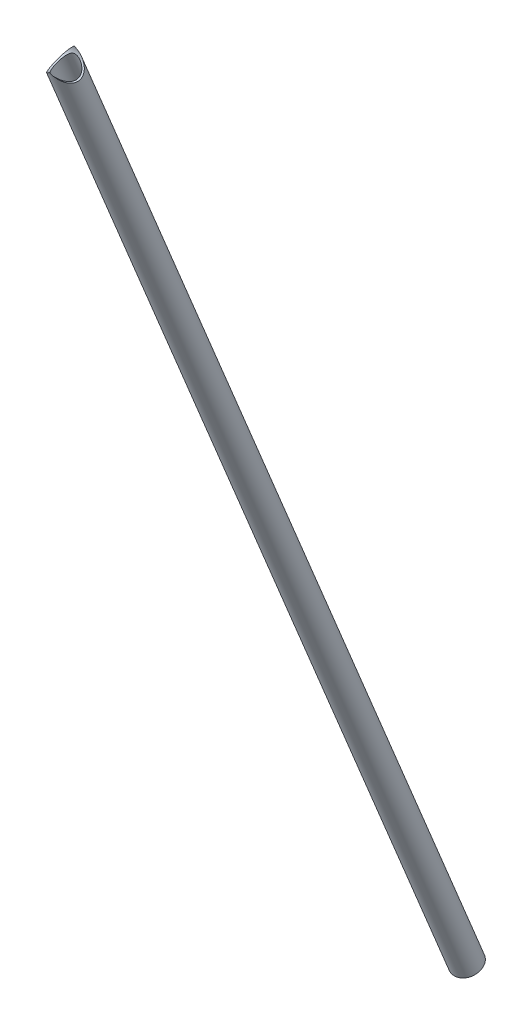
ISO-10303-21;
HEADER;
FILE_DESCRIPTION(('STEP AP214'),'2;1');
FILE_NAME('part.step','',(''),(''),'','','');
FILE_SCHEMA(('AUTOMOTIVE_DESIGN { 1 0 10303 214 1 1 1 1 }'));
ENDSEC;
DATA;
#1=APPLICATION_CONTEXT('core data for automotive mechanical design processes');
#2=APPLICATION_PROTOCOL_DEFINITION('international standard','automotive_design',2000,#1);
#3=PRODUCT_CONTEXT('',#1,'mechanical');
#4=PRODUCT('Part','Part','',(#3));
#5=PRODUCT_RELATED_PRODUCT_CATEGORY('part','',(#4));
#6=PRODUCT_DEFINITION_FORMATION('','',#4);
#7=PRODUCT_DEFINITION_CONTEXT('part definition',#1,'design');
#8=PRODUCT_DEFINITION('design','',#6,#7);
#9=PRODUCT_DEFINITION_SHAPE('','',#8);
#10=(LENGTH_UNIT() NAMED_UNIT(*) SI_UNIT(.MILLI.,.METRE.));
#11=(NAMED_UNIT(*) PLANE_ANGLE_UNIT() SI_UNIT($,.RADIAN.));
#12=(NAMED_UNIT(*) SI_UNIT($,.STERADIAN.) SOLID_ANGLE_UNIT());
#13=UNCERTAINTY_MEASURE_WITH_UNIT(LENGTH_MEASURE(1.E-05),#10,'distance_accuracy_value','');
#14=(GEOMETRIC_REPRESENTATION_CONTEXT(3) GLOBAL_UNCERTAINTY_ASSIGNED_CONTEXT((#13)) GLOBAL_UNIT_ASSIGNED_CONTEXT((#10,
#11,#12)) REPRESENTATION_CONTEXT('',''));
#15=CARTESIAN_POINT('',(0.,0.,0.));
#16=DIRECTION('',(0.,0.,1.));
#17=DIRECTION('',(1.,0.,0.));
#18=AXIS2_PLACEMENT_3D('',#15,#16,#17);
#19=CARTESIAN_POINT('',(-1.11022302462516E-13,220.,-2300.));
#20=DIRECTION('',(0.,0.924802742541058,0.380446957391614));
#21=DIRECTION('',(0.,-0.380446957391614,0.924802742541059));
#22=AXIS2_PLACEMENT_3D('',#19,#20,#21);
#23=CYLINDRICAL_SURFACE('',#22,9.39999999999998);
#24=CARTESIAN_POINT('',(-1.11022302462516E-13,220.,-2300.));
#25=DIRECTION('',(0.,-0.924802742541059,-0.380446957391614));
#26=DIRECTION('',(-0.14944830444176,0.376174363259909,-0.914416782832361));
#27=AXIS2_PLACEMENT_3D('',#24,#25,#26);
#28=CIRCLE('',#27,9.39999999999998);
#29=CARTESIAN_POINT('',(-1.40481406175265,223.536039014643,-2308.59551775862));
#30=VERTEX_POINT('',#29);
#31=EDGE_CURVE('E91',#30,#30,#28,.T.);
#32=ORIENTED_EDGE('',*,*,#31,.T.);
#33=EDGE_LOOP('',(#32));
#34=FACE_BOUND('',#33,.T.);
#35=CARTESIAN_POINT('',(-9.19613038601903,1006.93153407013,-1978.37615864122));
#36=CARTESIAN_POINT('',(-9.2368195698333,1006.8199690487,-1978.21426136457));
#37=CARTESIAN_POINT('',(-9.2716963255508,1006.71220936782,-1978.04829963062));
#38=CARTESIAN_POINT('',(-9.32925982289266,1006.50540981531,-1977.70900862443));
#39=CARTESIAN_POINT('',(-9.35194904871124,1006.4063681701,-1977.53568086138));
#40=CARTESIAN_POINT('',(-9.38470663027585,1006.21807700779,-1977.18271737702));
#41=CARTESIAN_POINT('',(-9.39478028474781,1006.12882339394,-1977.00308433665));
#42=CARTESIAN_POINT('',(-9.40209280611929,1005.96095461754,-1976.63864688724));
#43=CARTESIAN_POINT('',(-9.39933130351363,1005.88233976132,-1976.45384232948));
#44=CARTESIAN_POINT('',(-9.38095821569308,1005.73638335413,-1976.08028412091));
#45=CARTESIAN_POINT('',(-9.3653360796976,1005.66905111395,-1975.89152735169));
#46=CARTESIAN_POINT('',(-9.32145574517952,1005.54617687696,-1975.5116675257));
#47=CARTESIAN_POINT('',(-9.29319756942519,1005.49063485891,-1975.32056447314));
#48=CARTESIAN_POINT('',(-9.22447591778617,1005.39149083359,-1974.93740690215));
#49=CARTESIAN_POINT('',(-9.18400876850774,1005.34789242743,-1974.74535211449));
#50=CARTESIAN_POINT('',(-9.09148696279118,1005.27255663859,-1974.36172307694));
#51=CARTESIAN_POINT('',(-9.03943207453079,1005.24081949324,-1974.17014883675));
#52=CARTESIAN_POINT('',(-8.92485973757195,1005.18905671811,-1973.79003351721));
#53=CARTESIAN_POINT('',(-8.86241710771082,1005.16895163981,-1973.60148062476));
#54=CARTESIAN_POINT('',(-8.72759181529579,1005.13959771908,-1973.22707855864));
#55=CARTESIAN_POINT('',(-8.65520540833633,1005.13035297878,-1973.04123043277));
#56=CARTESIAN_POINT('',(-8.42430931051088,1005.11800762223,-1972.48914057645));
#57=CARTESIAN_POINT('',(-8.25200075547757,1005.13026981116,-1972.1281511215));
#58=CARTESIAN_POINT('',(-7.92241495262186,1005.1825908372,-1971.51148876773));
#59=CARTESIAN_POINT('',(-7.77165967434697,1005.21517105351,-1971.25153993998));
#60=CARTESIAN_POINT('',(-7.45449983396701,1005.29768275197,-1970.74407472378));
#61=CARTESIAN_POINT('',(-7.28808830149592,1005.34762198949,-1970.49656394887));
#62=CARTESIAN_POINT('',(-6.94083495069747,1005.46230286643,-1970.01452171284));
#63=CARTESIAN_POINT('',(-6.75995533600956,1005.52708415955,-1969.78002715072));
#64=CARTESIAN_POINT('',(-6.3852793504536,1005.66866959071,-1969.32553740829));
#65=CARTESIAN_POINT('',(-6.19148498038537,1005.7454718689,-1969.10553999249));
#66=CARTESIAN_POINT('',(-5.78629322227912,1005.91052517997,-1968.67520519157));
#67=CARTESIAN_POINT('',(-5.57456747977753,1005.99902363316,-1968.46527243704));
#68=CARTESIAN_POINT('',(-5.13808333809841,1006.18271665593,-1968.06242753798));
#69=CARTESIAN_POINT('',(-4.91332084646136,1006.27791333023,-1967.86952078666));
#70=CARTESIAN_POINT('',(-4.45075445836865,1006.47114595321,-1967.50273534701));
#71=CARTESIAN_POINT('',(-4.21297996984454,1006.56917528087,-1967.32881621167));
#72=CARTESIAN_POINT('',(-3.7229122478085,1006.76366898454,-1967.00206355323));
#73=CARTESIAN_POINT('',(-3.47063014512528,1006.86013448942,-1966.84921416254));
#74=CARTESIAN_POINT('',(-2.9407776145194,1007.04869677864,-1966.56344776887));
#75=CARTESIAN_POINT('',(-2.66263426651362,1007.14052696846,-1966.4314032795));
#76=CARTESIAN_POINT('',(-2.08757707664731,1007.30646480858,-1966.20081920209));
#77=CARTESIAN_POINT('',(-1.79069670835862,1007.38060299234,-1966.10222176418));
#78=CARTESIAN_POINT('',(-1.35630495372619,1007.4648789935,-1965.99236446654));
#79=CARTESIAN_POINT('',(-1.22552620294685,1007.48728007172,-1965.96351493774));
#80=CARTESIAN_POINT('',(-0.961510509877422,1007.52581159912,-1965.9142294316));
#81=CARTESIAN_POINT('',(-0.828274816650446,1007.5419451473,-1965.89378929592));
#82=CARTESIAN_POINT('',(-0.560214797858749,1007.56717532348,-1965.86194641215));
#83=CARTESIAN_POINT('',(-0.42539253423637,1007.57628023936,-1965.85053301972));
#84=CARTESIAN_POINT('',(-0.154977727309227,1007.58701466671,-1965.83708625215));
#85=CARTESIAN_POINT('',(-0.0193851920850444,1007.58864425645,-1965.83505277879));
#86=CARTESIAN_POINT('',(0.251623035822153,1007.58433341795,-1965.84044534655));
#87=CARTESIAN_POINT('',(0.387038435435792,1007.57838574981,-1965.84788043466));
#88=CARTESIAN_POINT('',(0.656496233537733,1007.55923987371,-1965.87195067634));
#89=CARTESIAN_POINT('',(0.790538601890245,1007.54604150697,-1965.88858603139));
#90=CARTESIAN_POINT('',(1.18969990013791,1007.49643918607,-1965.951617652));
#91=CARTESIAN_POINT('',(1.45161181740501,1007.45003366046,-1966.01113325318));
#92=CARTESIAN_POINT('',(1.90293722601168,1007.35099411518,-1966.14195998972));
#93=CARTESIAN_POINT('',(2.09507963987384,1007.30229919195,-1966.20733636848));
#94=CARTESIAN_POINT('',(2.47160361399269,1007.1968785038,-1966.35266008393));
#95=CARTESIAN_POINT('',(2.65598032491817,1007.1401478146,-1966.4326163638));
#96=CARTESIAN_POINT('',(3.01763767214196,1007.02132490035,-1966.60526906537));
#97=CARTESIAN_POINT('',(3.19489150850476,1006.95921477967,-1966.69800866932));
#98=CARTESIAN_POINT('',(3.54210027059951,1006.83213278866,-1966.89440144078));
#99=CARTESIAN_POINT('',(3.71205580428344,1006.76716115761,-1966.99805369676));
#100=CARTESIAN_POINT('',(4.15713026048397,1006.59225299918,-1967.28799958966));
#101=CARTESIAN_POINT('',(4.42622166947672,1006.48142238013,-1967.48304438556));
#102=CARTESIAN_POINT('',(4.94739536699051,1006.26365066648,-1967.8967822025));
#103=CARTESIAN_POINT('',(5.1994666208719,1006.15671211553,-1968.11549033054));
#104=CARTESIAN_POINT('',(5.68706685207523,1005.95192107668,-1968.57423959016));
#105=CARTESIAN_POINT('',(5.92260576854018,1005.85406311799,-1968.81426770419));
#106=CARTESIAN_POINT('',(6.37697544278926,1005.6718016789,-1969.31427121552));
#107=CARTESIAN_POINT('',(6.59581411815854,1005.58739180187,-1969.57423704166));
#108=CARTESIAN_POINT('',(6.96756296162638,1005.45346878391,-1970.05125990062));
#109=CARTESIAN_POINT('',(7.12409201982639,1005.40039111646,-1970.26450436537));
#110=CARTESIAN_POINT('',(7.42566758703917,1005.30656856467,-1970.70162229725));
#111=CARTESIAN_POINT('',(7.57071413516634,1005.26582363831,-1970.92549572817));
#112=CARTESIAN_POINT('',(7.84786058475258,1005.19865715048,-1971.38270687497));
#113=CARTESIAN_POINT('',(7.9799816613182,1005.17221182961,-1971.61602819496));
#114=CARTESIAN_POINT('',(8.23001947080597,1005.13547149385,-1972.09140275276));
#115=CARTESIAN_POINT('',(8.34793960827136,1005.12517260086,-1972.33345387952));
#116=CARTESIAN_POINT('',(8.54507578713481,1005.1228290375,-1972.77396737446));
#117=CARTESIAN_POINT('',(8.62725261299678,1005.12744953073,-1972.97109103682));
#118=CARTESIAN_POINT('',(8.78061535280849,1005.14883079494,-1973.36890886793));
#119=CARTESIAN_POINT('',(8.85180372709067,1005.1655888435,-1973.56960222617));
#120=CARTESIAN_POINT('',(8.98221937052795,1005.2119245614,-1973.973318399));
#121=CARTESIAN_POINT('',(9.04145121391672,1005.24149731451,-1974.17634029122));
#122=CARTESIAN_POINT('',(9.14708086018697,1005.31393981788,-1974.58337376007));
#123=CARTESIAN_POINT('',(9.19347853917895,1005.35680969648,-1974.78738534623));
#124=CARTESIAN_POINT('',(9.27288762199838,1005.45633616168,-1975.19597223158));
#125=CARTESIAN_POINT('',(9.30581952623126,1005.51307155378,-1975.40054389863));
#126=CARTESIAN_POINT('',(9.35731972347404,1005.64006542588,-1975.80729486054));
#127=CARTESIAN_POINT('',(9.37588801145611,1005.71032391063,-1976.00947415457));
#128=CARTESIAN_POINT('',(9.39834413203995,1005.86386105151,-1976.40962588544));
#129=CARTESIAN_POINT('',(9.40223420737595,1005.94713771652,-1976.60759896038));
#130=CARTESIAN_POINT('',(9.3953272682473,1006.12589312077,-1976.99768075768));
#131=CARTESIAN_POINT('',(9.38453093978437,1006.22137128987,-1977.18978975353));
#132=CARTESIAN_POINT('',(9.3501608973978,1006.41433474854,-1977.54970687713));
#133=CARTESIAN_POINT('',(9.32782312059161,1006.5108679501,-1977.71814703017));
#134=CARTESIAN_POINT('',(9.2716142224992,1006.71219930886,-1978.04809461431));
#135=CARTESIAN_POINT('',(9.23773880239081,1006.81700053544,-1978.20959943606));
#136=CARTESIAN_POINT('',(9.15898862198497,1007.03379507839,-1978.52488929624));
#137=CARTESIAN_POINT('',(9.11411430956979,1007.14578810176,-1978.6786746487));
#138=CARTESIAN_POINT('',(9.01398149661343,1007.37592785733,-1978.97805576918));
#139=CARTESIAN_POINT('',(8.9587208597008,1007.49407585192,-1979.1236498443));
#140=CARTESIAN_POINT('',(8.8189431715864,1007.7746936511,-1979.45222027634));
#141=CARTESIAN_POINT('',(8.7307516748473,1007.93910339109,-1979.63199348164));
#142=CARTESIAN_POINT('',(8.5388642384129,1008.27461268667,-1979.97628800212));
#143=CARTESIAN_POINT('',(8.43516415255197,1008.44571402217,-1980.14080521955));
#144=CARTESIAN_POINT('',(8.10260619407152,1008.96655725518,-1980.61208757059));
#145=CARTESIAN_POINT('',(7.8524352601941,1009.32355083081,-1980.89625512025));
#146=CARTESIAN_POINT('',(7.40178967505052,1009.91535416004,-1981.31705540215));
#147=CARTESIAN_POINT('',(7.21474055515977,1010.14901989168,-1981.47044345828));
#148=CARTESIAN_POINT('',(6.82257751505272,1010.6152077816,-1981.75463476619));
#149=CARTESIAN_POINT('',(6.61745690753412,1010.84772948266,-1981.88542960395));
#150=CARTESIAN_POINT('',(6.19022104805452,1011.30846983166,-1982.12584022236));
#151=CARTESIAN_POINT('',(5.96808851817852,1011.53668380337,-1982.23543406142));
#152=CARTESIAN_POINT('',(5.5075336811242,1011.98510284695,-1982.43473519743));
#153=CARTESIAN_POINT('',(5.26911664296452,1012.20531047436,-1982.52444888731));
#154=CARTESIAN_POINT('',(4.8361654031552,1012.58114213759,-1982.66575137468));
#155=CARTESIAN_POINT('',(4.64517613216669,1012.73937995116,-1982.72129688415));
#156=CARTESIAN_POINT('',(4.25336818181206,1013.04667327647,-1982.82253374712));
#157=CARTESIAN_POINT('',(4.05254844386103,1013.1957277954,-1982.8682240365));
#158=CARTESIAN_POINT('',(3.64099659414527,1013.4813713388,-1982.95029113661));
#159=CARTESIAN_POINT('',(3.43028702270122,1013.61798680446,-1982.98668801413));
#160=CARTESIAN_POINT('',(2.99816666135798,1013.87512527649,-1983.05093152541));
#161=CARTESIAN_POINT('',(2.77676206193251,1013.99565744368,-1983.07878303834));
#162=CARTESIAN_POINT('',(2.26609051688163,1014.24304268472,-1983.13259872698));
#163=CARTESIAN_POINT('',(1.9736210091688,1014.3640373592,-1983.15637811247));
#164=CARTESIAN_POINT('',(1.52360402835537,1014.51142300694,-1983.18378977259));
#165=CARTESIAN_POINT('',(1.37181072272262,1014.55485075059,-1983.19154849475));
#166=CARTESIAN_POINT('',(1.06504272596051,1014.62884294138,-1983.20446726913));
#167=CARTESIAN_POINT('',(0.910069783626933,1014.65941427064,-1983.20962871198));
#168=CARTESIAN_POINT('',(0.596181055461285,1014.70666484586,-1983.21750293641));
#169=CARTESIAN_POINT('',(0.437240618454389,1014.72318670087,-1983.22018800357));
#170=CARTESIAN_POINT('',(0.118483508159709,1014.74095144108,-1983.22307213469));
#171=CARTESIAN_POINT('',(-0.0413331086146957,1014.74219530037,-1983.22327135714));
#172=CARTESIAN_POINT('',(-0.360411667001451,1014.7293374898,-1983.22118801632));
#173=CARTESIAN_POINT('',(-0.519673257818029,1014.7152274346,-1983.21890409693));
#174=CARTESIAN_POINT('',(-0.836147471867817,1014.67235305128,-1983.21179996827));
#175=CARTESIAN_POINT('',(-0.993359779435019,1014.64358649223,-1983.20697937288));
#176=CARTESIAN_POINT('',(-1.32772864585746,1014.56741209654,-1983.19378796047));
#177=CARTESIAN_POINT('',(-1.5043800467695,1014.51787039972,-1983.18499624096));
#178=CARTESIAN_POINT('',(-1.85252443803527,1014.40354203393,-1983.16371792486));
#179=CARTESIAN_POINT('',(-2.02401330727258,1014.33874353171,-1983.15122845832));
#180=CARTESIAN_POINT('',(-2.36168728393226,1014.19622271855,-1983.12227415865));
#181=CARTESIAN_POINT('',(-2.52785678808458,1014.1184659192,-1983.10579866239));
#182=CARTESIAN_POINT('',(-2.85426641342993,1013.95243937418,-1983.06864057323));
#183=CARTESIAN_POINT('',(-3.01450784185935,1013.86417196461,-1983.04795891445));
#184=CARTESIAN_POINT('',(-3.43187773101777,1013.61868602818,-1982.98717731252));
#185=CARTESIAN_POINT('',(-3.68407922318914,1013.45402516003,-1982.94320702472));
#186=CARTESIAN_POINT('',(-4.17389267676055,1013.1079152813,-1982.8419113568));
#187=CARTESIAN_POINT('',(-4.41149522767835,1012.92645562724,-1982.78457747429));
#188=CARTESIAN_POINT('',(-4.87316593826735,1012.55129703054,-1982.65538715382));
#189=CARTESIAN_POINT('',(-5.09721645471584,1012.35758277728,-1982.58351229217));
#190=CARTESIAN_POINT('',(-5.53183202453224,1011.9617348244,-1982.42422733752));
#191=CARTESIAN_POINT('',(-5.74239999647522,1011.7596029627,-1982.33682062228));
#192=CARTESIAN_POINT('',(-6.16183468268615,1011.33790332128,-1982.1398648096));
#193=CARTESIAN_POINT('',(-6.36990517339137,1011.11800177146,-1982.02933048356));
#194=CARTESIAN_POINT('',(-6.77044324901078,1010.67480170721,-1981.78836537866));
#195=CARTESIAN_POINT('',(-6.96290841492021,1010.45150267247,-1981.65793152416));
#196=CARTESIAN_POINT('',(-7.33077166393479,1010.00468805867,-1981.3761367967));
#197=CARTESIAN_POINT('',(-7.50619502589348,1009.78117331284,-1981.22480775163));
#198=CARTESIAN_POINT('',(-7.83866452973053,1009.33645641311,-1980.89986206636));
#199=CARTESIAN_POINT('',(-7.99570690989731,1009.11525474099,-1980.72624087921));
#200=CARTESIAN_POINT('',(-8.26133495667832,1008.71990423027,-1980.39095576683));
#201=CARTESIAN_POINT('',(-8.37346555547444,1008.54477624035,-1980.23325186499));
#202=CARTESIAN_POINT('',(-8.58269460316944,1008.2003211223,-1979.90248001764));
#203=CARTESIAN_POINT('',(-8.67980321240377,1008.03099013418,-1979.72942258246));
#204=CARTESIAN_POINT('',(-8.85740787357393,1007.70044569944,-1979.36818191471));
#205=CARTESIAN_POINT('',(-8.93792709272489,1007.5392211734,-1979.18002029296));
#206=CARTESIAN_POINT('',(-9.08092372199696,1007.22704812772,-1978.78889706637));
#207=CARTESIAN_POINT('',(-9.14340663226013,1007.07609648616,-1978.58593999706));
#208=CARTESIAN_POINT('',(-9.19613038601903,1006.93153407013,-1978.37615864122));
#209=B_SPLINE_CURVE_WITH_KNOTS('',3,(#35,#36,#37,#38,#39,#40,#41,#42,#43,#44,#45,#46,#47,#48,
#49,#50,#51,#52,#53,#54,#55,#56,#57,#58,#59,#60,#61,#62,#63,#64,#65,#66,#67,#68,#69,#70,#71,#72,
#73,#74,#75,#76,#77,#78,#79,#80,#81,#82,#83,#84,#85,#86,#87,#88,#89,#90,#91,#92,#93,#94,#95,#96,
#97,#98,#99,#100,#101,#102,#103,#104,#105,#106,#107,#108,#109,#110,#111,#112,#113,#114,#115,
#116,#117,#118,#119,#120,#121,#122,#123,#124,#125,#126,#127,#128,#129,#130,#131,#132,#133,#134,
#135,#136,#137,#138,#139,#140,#141,#142,#143,#144,#145,#146,#147,#148,#149,#150,#151,#152,#153,
#154,#155,#156,#157,#158,#159,#160,#161,#162,#163,#164,#165,#166,#167,#168,#169,#170,#171,#172,
#173,#174,#175,#176,#177,#178,#179,#180,#181,#182,#183,#184,#185,#186,#187,#188,#189,#190,#191,
#192,#193,#194,#195,#196,#197,#198,#199,#200,#201,#202,#203,#204,#205,#206,#207,#208),
.UNSPECIFIED.,.T.,.F.,(4,2,2,2,2,2,2,2,2,2,2,2,2,2,2,2,2,2,2,2,2,2,2,2,2,2,2,2,2,2,2,2,2,2,2,2,
2,2,2,2,2,2,2,2,2,2,2,2,2,2,2,2,2,2,2,2,2,2,2,2,2,2,2,2,2,2,2,2,2,2,2,2,2,2,2,2,2,2,2,2,2,2,2,2,
2,2,4),(0.,0.602141926506189,1.20416107131065,1.80592727430275,2.40771080136061,
3.00998852031307,3.61226515405453,4.21472317972975,4.81719325915695,5.41549827563041,
6.01402920919936,7.21045765621416,8.11615522109047,9.02225793975104,9.93081033189059,
10.8392222936196,11.7714570557487,12.7039860630897,13.6344881762473,14.5642856565103,
15.5262501014629,16.4865421511108,16.8935409901033,17.3003383309718,17.7066552579445,
18.1129679302677,18.5196691167014,18.9263792105161,19.7405141908971,20.365876781499,
20.9916242620173,21.6195398356501,22.2474030017596,23.2969257428482,24.3471225118472,
25.3966824028211,26.4457415655138,27.2544861136804,28.063227906793,28.8706217794492,
29.6778216999516,30.318074905895,30.9581845494966,31.5980488390184,32.2379193050003,
32.8815147301614,33.5251103806055,34.16860768989,34.8120749424557,35.3976947456436,
35.9835329846373,36.5693473718672,37.1552823878613,37.9313800874294,38.7076856460763,
40.2616590373008,41.2696005826591,42.2779166932354,43.2872708244693,44.2962999019827,
45.0583211316699,45.8204246002106,46.5808683101806,47.3408770160497,48.2895493704425,
48.7632972747335,49.2367912553104,49.7155222392975,50.1942227002475,50.6731847280776,
51.152219682215,51.7023912222706,52.2529908918519,52.8050800931098,53.3570468151488,
54.2687876572245,55.181110171889,56.09459593784,57.0078832877054,57.9737625169108,
58.9397911833946,59.9043642873962,60.8691344496893,61.6512394225583,62.4328130727014,
63.2132877380998,63.993524147017),.UNSPECIFIED.);
#210=CARTESIAN_POINT('',(-9.19613038601903,1006.93153407013,-1978.37615864122));
#211=VERTEX_POINT('',#210);
#212=EDGE_CURVE('E46',#211,#211,#209,.T.);
#213=ORIENTED_EDGE('',*,*,#212,.T.);
#214=EDGE_LOOP('',(#213));
#215=FACE_BOUND('',#214,.T.);
#216=ADVANCED_FACE('F41',(#34,#215),#23,.F.);
#217=CARTESIAN_POINT('',(-1.11022302462516E-13,220.,-2300.));
#218=DIRECTION('',(0.,0.924802742541058,0.380446957391614));
#219=DIRECTION('',(0.,-0.380446957391614,0.924802742541059));
#220=AXIS2_PLACEMENT_3D('',#217,#218,#219);
#221=CYLINDRICAL_SURFACE('',#220,11.);
#222=CARTESIAN_POINT('',(-1.11022302462516E-13,220.,-2300.));
#223=DIRECTION('',(0.,-0.924802742541059,-0.380446957391614));
#224=DIRECTION('',(-0.14944830444176,0.376174363259909,-0.914416782832361));
#225=AXIS2_PLACEMENT_3D('',#222,#223,#224);
#226=CIRCLE('',#225,11.);
#227=CARTESIAN_POINT('',(-1.64393134885947,224.137917995859,-2310.05858461116));
#228=VERTEX_POINT('',#227);
#229=EDGE_CURVE('E63',#228,#228,#226,.T.);
#230=ORIENTED_EDGE('',*,*,#229,.F.);
#231=EDGE_LOOP('',(#230));
#232=FACE_BOUND('',#231,.T.);
#233=CARTESIAN_POINT('',(-1.18687778030713E-13,1020.63206073329,-1982.52902160579));
#234=CARTESIAN_POINT('',(-0.00515471055095744,1020.62742499272,-1982.53092866347));
#235=CARTESIAN_POINT('',(-0.0103093292578846,1020.62278773058,-1982.53283243051));
#236=CARTESIAN_POINT('',(-0.440616414545313,1020.23553558094,-1982.69148688348));
#237=CARTESIAN_POINT('',(-0.865121979259571,1019.84258888535,-1982.82584864598));
#238=CARTESIAN_POINT('',(-1.70952443637622,1019.03870281787,-1983.04898096187));
#239=CARTESIAN_POINT('',(-2.12941731775094,1018.62774913141,-1983.1377145027));
#240=CARTESIAN_POINT('',(-2.96223502494686,1017.7894272037,-1983.26839357438));
#241=CARTESIAN_POINT('',(-3.37513975186292,1017.36202040836,-1983.31022129715));
#242=CARTESIAN_POINT('',(-4.18925267717053,1016.49451679913,-1983.34475323002));
#243=CARTESIAN_POINT('',(-4.59046643392696,1016.05442622034,-1983.33748117989));
#244=CARTESIAN_POINT('',(-5.27848651839499,1015.27619581412,-1983.27951573501));
#245=CARTESIAN_POINT('',(-5.56871921573428,1014.94021030683,-1983.24018628778));
#246=CARTESIAN_POINT('',(-6.13856313974478,1014.26409774177,-1983.13103688073));
#247=CARTESIAN_POINT('',(-6.4181741547619,1013.92397060164,-1983.06121631369));
#248=CARTESIAN_POINT('',(-6.96388998349826,1013.24206551233,-1982.88949578209));
#249=CARTESIAN_POINT('',(-7.23002021033764,1012.90029210902,-1982.7876590008));
#250=CARTESIAN_POINT('',(-7.7465276509372,1012.21674453809,-1982.54980922194));
#251=CARTESIAN_POINT('',(-7.99691027130486,1011.87497041147,-1982.41380803497));
#252=CARTESIAN_POINT('',(-8.40939701774432,1011.29204655502,-1982.14958327857));
#253=CARTESIAN_POINT('',(-8.57622117885758,1011.05015564484,-1982.0303198295));
#254=CARTESIAN_POINT('',(-8.89864215527205,1010.56923204477,-1981.77232151234));
#255=CARTESIAN_POINT('',(-9.05423951186609,1010.33019921755,-1981.63358758396));
#256=CARTESIAN_POINT('',(-9.35232899983836,1009.85691593615,-1981.33590859749));
#257=CARTESIAN_POINT('',(-9.49483270994255,1009.62266140199,-1981.17698169832));
#258=CARTESIAN_POINT('',(-9.76485862611614,1009.16086573134,-1980.83808073319));
#259=CARTESIAN_POINT('',(-9.89238613928665,1008.9333222382,-1980.65811416843));
#260=CARTESIAN_POINT('',(-10.1038874790173,1008.53686451799,-1980.31887344209));
#261=CARTESIAN_POINT('',(-10.191252742983,1008.36612417505,-1980.16384053671));
#262=CARTESIAN_POINT('',(-10.3543662248395,1008.03173870812,-1979.84071453915));
#263=CARTESIAN_POINT('',(-10.4301209727457,1007.86808963327,-1979.67262886889));
#264=CARTESIAN_POINT('',(-10.5688610248736,1007.54941990092,-1979.3235406971));
#265=CARTESIAN_POINT('',(-10.6318492381572,1007.3943972836,-1979.14254115095));
#266=CARTESIAN_POINT('',(-10.7439099093822,1007.09466444883,-1978.76807395103));
#267=CARTESIAN_POINT('',(-10.7929822186015,1006.94995434161,-1978.57460616403));
#268=CARTESIAN_POINT('',(-10.8765118823903,1006.67141175405,-1978.17429746609));
#269=CARTESIAN_POINT('',(-10.9108351747103,1006.53768763581,-1977.96735279346));
#270=CARTESIAN_POINT('',(-10.9633395227386,1006.28438083561,-1977.54299271077));
#271=CARTESIAN_POINT('',(-10.9815205842197,1006.1647981486,-1977.32557730445));
#272=CARTESIAN_POINT('',(-11.0011665174091,1005.94147697767,-1976.88219008201));
#273=CARTESIAN_POINT('',(-11.0026421850974,1005.83772830367,-1976.65622388666));
#274=CARTESIAN_POINT('',(-10.9887393460218,1005.64728897499,-1976.19773296342));
#275=CARTESIAN_POINT('',(-10.9733628996488,1005.56059623652,-1975.96520904068));
#276=CARTESIAN_POINT('',(-10.9292667062822,1005.41568294842,-1975.52786881808));
#277=CARTESIAN_POINT('',(-10.902646042768,1005.35519365228,-1975.32358502743));
#278=CARTESIAN_POINT('',(-10.8374730716224,1005.24779318626,-1974.91335641618));
#279=CARTESIAN_POINT('',(-10.7989205454964,1005.20088226506,-1974.70741156523));
#280=CARTESIAN_POINT('',(-10.7105030211445,1005.1206022743,-1974.29531576266));
#281=CARTESIAN_POINT('',(-10.6606373008358,1005.0872340695,-1974.08916479872));
#282=CARTESIAN_POINT('',(-10.5503564000211,1005.03375040221,-1973.6779767051));
#283=CARTESIAN_POINT('',(-10.4899405802978,1005.01363574309,-1973.47293964367));
#284=CARTESIAN_POINT('',(-10.3576883876248,1004.98581392399,-1973.05976416641));
#285=CARTESIAN_POINT('',(-10.2855935089115,1004.97844688691,-1972.85168594574));
#286=CARTESIAN_POINT('',(-10.1321204944556,1004.97647474941,-1972.4388942606));
#287=CARTESIAN_POINT('',(-10.0507396199498,1004.98187342334,-1972.23418180927));
#288=CARTESIAN_POINT('',(-9.79410986783974,1005.01606659164,-1971.62643611105));
#289=CARTESIAN_POINT('',(-9.60632378988491,1005.06284906524,-1971.22964106648));
#290=CARTESIAN_POINT('',(-9.08189298680684,1005.23891965389,-1970.22219600612));
#291=CARTESIAN_POINT('',(-8.72416223525944,1005.40107813678,-1969.62821071101));
#292=CARTESIAN_POINT('',(-8.15295442802933,1005.70577631218,-1968.78387184551));
#293=CARTESIAN_POINT('',(-7.95639426541608,1005.8178457371,-1968.50974318476));
#294=CARTESIAN_POINT('',(-7.55349907223989,1006.06013108436,-1967.97702078944));
#295=CARTESIAN_POINT('',(-7.34716431157224,1006.19034650585,-1967.71842662637));
#296=CARTESIAN_POINT('',(-6.83210172897073,1006.5286499067,-1967.10438647567));
#297=CARTESIAN_POINT('',(-6.51893367061073,1006.74548079384,-1966.75748386313));
#298=CARTESIAN_POINT('',(-5.87944282045122,1007.20714896651,-1966.09581004392));
#299=CARTESIAN_POINT('',(-5.55311364403411,1007.45199995338,-1965.7810547003));
#300=CARTESIAN_POINT('',(-4.89018914954965,1007.96549067499,-1965.18320016259));
#301=CARTESIAN_POINT('',(-4.553590530991,1008.2341381116,-1964.90011128513));
#302=CARTESIAN_POINT('',(-3.87257824504928,1008.79172454273,-1964.36541076059));
#303=CARTESIAN_POINT('',(-3.52816683662647,1009.08065772127,-1964.11379014856));
#304=CARTESIAN_POINT('',(-2.92165409875978,1009.60046457035,-1963.70185470261));
#305=CARTESIAN_POINT('',(-2.66088748627512,1009.82742402414,-1963.53459020932));
#306=CARTESIAN_POINT('',(-2.13664826668943,1010.29025212942,-1963.2175230883));
#307=CARTESIAN_POINT('',(-1.87317519635825,1010.5261223252,-1963.06772350588));
#308=CARTESIAN_POINT('',(-1.08062627145202,1011.24497196484,-1962.64531615781));
#309=CARTESIAN_POINT('',(-0.548202172715866,1011.74023761172,-1962.39887486801));
#310=CARTESIAN_POINT('',(-0.00974071323224675,1012.25294983532,-1962.1871815037));
#311=CARTESIAN_POINT('',(-0.00487040397547197,1012.25758822082,-1962.18526985903));
#312=CARTESIAN_POINT('',(-1.03356826894319E-13,1012.26222767067,-1962.18336126989));
#313=B_SPLINE_CURVE_WITH_KNOTS('',3,(#233,#234,#235,#236,#237,#238,#239,#240,#241,#242,#243,
#244,#245,#246,#247,#248,#249,#250,#251,#252,#253,#254,#255,#256,#257,#258,#259,#260,#261,#262,
#263,#264,#265,#266,#267,#268,#269,#270,#271,#272,#273,#274,#275,#276,#277,#278,#279,#280,#281,
#282,#283,#284,#285,#286,#287,#288,#289,#290,#291,#292,#293,#294,#295,#296,#297,#298,#299,#300,
#301,#302,#303,#304,#305,#306,#307,#308,#309,#310,#311,#312),.UNSPECIFIED.,.F.,.F.,(4,2,2,2,2,2,
2,2,2,2,2,2,2,2,2,2,2,2,2,2,2,2,2,2,2,2,2,2,2,2,2,2,2,2,2,2,2,2,2,4),(0.,0.0215705221060876,
1.8007383818652,3.58134719458443,5.36641821602872,7.15062621583254,8.48673103460542,
9.82286246346307,11.1563734468656,12.4894240697078,13.4400785928614,14.3906872501747,
15.3404470257553,16.2898692136861,17.0290738746414,17.7678612524601,18.5064800958627,
19.2451068327439,19.9903122182127,20.73551733718,21.4802408345005,22.2248732898065,
22.8682360777751,23.5116106476136,24.1550262934272,24.7984809365175,25.4588533029344,
26.1194209420238,27.4400757088327,29.5637264241218,30.6294328765548,31.6951099199331,
33.2384639176492,34.782575839413,36.3271893616188,37.8713618334745,39.0229576296837,
40.1747539277633,42.4729507157478,42.4939268949634),.UNSPECIFIED.);
#314=CARTESIAN_POINT('',(-1.18687778030713E-13,1020.63206073329,-1982.52902160579));
#315=VERTEX_POINT('',#314);
#316=CARTESIAN_POINT('',(-1.03356826894319E-13,1012.26222767067,-1962.18336126989));
#317=VERTEX_POINT('',#316);
#318=EDGE_CURVE('E56',#315,#317,#313,.T.);
#319=ORIENTED_EDGE('',*,*,#318,.F.);
#320=CARTESIAN_POINT('',(-1.03356826894319E-13,1012.26222767067,-1962.18336126989));
#321=CARTESIAN_POINT('',(0.00487042047845416,1012.25758820412,-1962.18526986501));
#322=CARTESIAN_POINT('',(0.00974072963798952,1012.25294981872,-1962.18718150967));
#323=CARTESIAN_POINT('',(0.451037350797212,1011.83275609748,-1962.36067505969));
#324=CARTESIAN_POINT('',(0.886552016442099,1011.42590113497,-1962.55673247229));
#325=CARTESIAN_POINT('',(1.75292875402433,1010.632741661,-1962.99621330354));
#326=CARTESIAN_POINT('',(2.18378655410486,1010.24645492119,-1963.23967686339));
#327=CARTESIAN_POINT('',(3.03881187817465,1009.49739172172,-1963.77372374405));
#328=CARTESIAN_POINT('',(3.46296252795,1009.13466906054,-1964.0644099266));
#329=CARTESIAN_POINT('',(4.30024171724237,1008.43832200002,-1964.69232529538));
#330=CARTESIAN_POINT('',(4.71337695836057,1008.10467961475,-1965.02952537496));
#331=CARTESIAN_POINT('',(5.38965693109232,1007.57754129573,-1965.63087122276));
#332=CARTESIAN_POINT('',(5.65693914748209,1007.37437202905,-1965.88195568554));
#333=CARTESIAN_POINT('',(6.18347009483128,1006.98567208381,-1966.40542651302));
#334=CARTESIAN_POINT('',(6.44271886860463,1006.80014131124,-1966.67781276417));
#335=CARTESIAN_POINT('',(6.95079301500154,1006.44974967144,-1967.24357839807));
#336=CARTESIAN_POINT('',(7.19963819144969,1006.28484821922,-1967.53691471909));
#337=CARTESIAN_POINT('',(7.6850685754266,1005.97854239281,-1968.14520990428));
#338=CARTESIAN_POINT('',(7.92165774678482,1005.83713038861,-1968.46016169998));
#339=CARTESIAN_POINT('',(8.31549332140818,1005.61744874985,-1969.02041808662));
#340=CARTESIAN_POINT('',(8.47642142916169,1005.53258163379,-1969.26056044293));
#341=CARTESIAN_POINT('',(8.78897682067567,1005.37876236359,-1969.75180517358));
#342=CARTESIAN_POINT('',(8.94060447495243,1005.30980957513,-1970.00290711061));
#343=CARTESIAN_POINT('',(9.23276803796935,1005.18977305185,-1970.5153560967));
#344=CARTESIAN_POINT('',(9.373313687417,1005.13867348596,-1970.77669383941));
#345=CARTESIAN_POINT('',(9.6414999453206,1005.05632190521,-1971.308921067));
#346=CARTESIAN_POINT('',(9.76914522653135,1005.02506268199,-1971.57980704504));
#347=CARTESIAN_POINT('',(9.98350469860197,1004.98884237356,-1972.07057453004));
#348=CARTESIAN_POINT('',(10.0731152267561,1004.97966898267,-1972.28888415623));
#349=CARTESIAN_POINT('',(10.2418839047677,1004.97580034516,-1972.7295350182));
#350=CARTESIAN_POINT('',(10.3210479054624,1004.98109695787,-1972.95187391722));
#351=CARTESIAN_POINT('',(10.4677824233648,1005.00701694179,-1973.39940822128));
#352=CARTESIAN_POINT('',(10.5353569510312,1005.02763499789,-1973.6246026091));
#353=CARTESIAN_POINT('',(10.6578148096439,1005.08486449632,-1974.07643732683));
#354=CARTESIAN_POINT('',(10.7126980351081,1005.12147607156,-1974.30307766873));
#355=CARTESIAN_POINT('',(10.8090971727349,1005.21139822011,-1974.75765703453));
#356=CARTESIAN_POINT('',(10.8505155600178,1005.26482533948,-1974.98559387442));
#357=CARTESIAN_POINT('',(10.9186259221749,1005.38831424493,-1975.43916723968));
#358=CARTESIAN_POINT('',(10.9453179000499,1005.45837602762,-1975.66480376552));
#359=CARTESIAN_POINT('',(10.983449300995,1005.61470596617,-1976.11164319704));
#360=CARTESIAN_POINT('',(10.9948929178551,1005.70096965853,-1976.33284730527));
#361=CARTESIAN_POINT('',(11.0023746918029,1005.88888969258,-1976.76887158594));
#362=CARTESIAN_POINT('',(10.9984138808061,1005.99054500276,-1976.98369218501));
#363=CARTESIAN_POINT('',(10.9765456361044,1006.19630043224,-1977.38237144394));
#364=CARTESIAN_POINT('',(10.9601904064665,1006.29895118389,-1977.56706856571));
#365=CARTESIAN_POINT('',(10.9157498441192,1006.51457539125,-1977.92895400958));
#366=CARTESIAN_POINT('',(10.8876601811567,1006.62755264561,-1978.10613953314));
#367=CARTESIAN_POINT('',(10.8202834193148,1006.86268105047,-1978.45207048718));
#368=CARTESIAN_POINT('',(10.7809964803964,1006.9848320699,-1978.62081603819));
#369=CARTESIAN_POINT('',(10.6918759527723,1007.23718134966,-1978.94928167649));
#370=CARTESIAN_POINT('',(10.6420401831685,1007.36738127009,-1979.10899988878));
#371=CARTESIAN_POINT('',(10.5154297743402,1007.67647992361,-1979.46743789707));
#372=CARTESIAN_POINT('',(10.4351031730469,1007.85788483879,-1979.66275311923));
#373=CARTESIAN_POINT('',(10.2592291663791,1008.23024928166,-1980.03669767183));
#374=CARTESIAN_POINT('',(10.1636778712419,1008.42121124251,-1980.21532271952));
#375=CARTESIAN_POINT('',(9.95890780317473,1008.8108157784,-1980.55609583687));
#376=CARTESIAN_POINT('',(9.84967184357266,1009.00946779076,-1980.71822271399));
#377=CARTESIAN_POINT('',(9.61917419698223,1009.41245253545,-1981.02607769917));
#378=CARTESIAN_POINT('',(9.49790902393946,1009.6167869021,-1981.17180102723));
#379=CARTESIAN_POINT('',(9.1975149694649,1010.10666367143,-1981.498742002));
#380=CARTESIAN_POINT('',(9.01368401840766,1010.39404688531,-1981.67290315878));
#381=CARTESIAN_POINT('',(8.62921433403674,1010.97342218514,-1981.99265779566));
#382=CARTESIAN_POINT('',(8.42856965058017,1011.26541587275,-1982.13824110104));
#383=CARTESIAN_POINT('',(8.01285423013209,1011.85193463812,-1982.40257487564));
#384=CARTESIAN_POINT('',(7.797762801726,1012.14646279621,-1982.5212857462));
#385=CARTESIAN_POINT('',(7.3556581035184,1012.73567791077,-1982.7330978404));
#386=CARTESIAN_POINT('',(7.12864486116249,1013.03036486687,-1982.82619912299));
#387=CARTESIAN_POINT('',(6.57870052345339,1013.72715765315,-1983.01812315325));
#388=CARTESIAN_POINT('',(6.25133233811822,1014.12870512778,-1983.10633972765));
#389=CARTESIAN_POINT('',(5.58151366689228,1014.92635112555,-1983.24030344213));
#390=CARTESIAN_POINT('',(5.23905699206305,1015.32244732361,-1983.28603298194));
#391=CARTESIAN_POINT('',(4.54237969758245,1016.10665456725,-1983.33734802296));
#392=CARTESIAN_POINT('',(4.18816076470022,1016.49476674497,-1983.34293925544));
#393=CARTESIAN_POINT('',(3.47076808860259,1017.26092144655,-1983.31582682005));
#394=CARTESIAN_POINT('',(3.10759747602917,1017.63896739725,-1983.28313635938));
#395=CARTESIAN_POINT('',(2.29373536051005,1018.46546214537,-1983.16957569302));
#396=CARTESIAN_POINT('',(1.84139871137379,1018.91105969882,-1983.07967324153));
#397=CARTESIAN_POINT('',(0.931436080596729,1019.78113890204,-1982.84670597357));
#398=CARTESIAN_POINT('',(0.473820057203869,1020.20565417807,-1982.70372911474));
#399=CARTESIAN_POINT('',(0.0103093277745276,1020.62278773185,-1982.53283242962));
#400=CARTESIAN_POINT('',(0.00515470907646922,1020.62742499398,-1982.53092866257));
#401=CARTESIAN_POINT('',(-1.18687778030713E-13,1020.63206073329,-1982.52902160579));
#402=B_SPLINE_CURVE_WITH_KNOTS('',3,(#320,#321,#322,#323,#324,#325,#326,#327,#328,#329,#330,
#331,#332,#333,#334,#335,#336,#337,#338,#339,#340,#341,#342,#343,#344,#345,#346,#347,#348,#349,
#350,#351,#352,#353,#354,#355,#356,#357,#358,#359,#360,#361,#362,#363,#364,#365,#366,#367,#368,
#369,#370,#371,#372,#373,#374,#375,#376,#377,#378,#379,#380,#381,#382,#383,#384,#385,#386,#387,
#388,#389,#390,#391,#392,#393,#394,#395,#396,#397,#398,#399,#400,#401),.UNSPECIFIED.,.F.,.F.,(4,
2,2,2,2,2,2,2,2,2,2,2,2,2,2,2,2,2,2,2,2,2,2,2,2,2,2,2,2,2,2,2,2,2,2,2,2,2,2,2,4),(0.,
0.0209761792156467,1.90068689986942,3.78199624346901,5.66745985498987,7.55174892120402,
8.8086118693091,10.0654681178566,11.3198114549747,12.5737465474235,13.4769180919187,
14.3800536319969,15.2823862862297,16.1843909183671,16.8922424675997,17.5996958689448,
18.3069039647132,19.0141179381453,19.7263456463286,20.4385732093778,21.1506048464685,
21.8625887866327,22.4976895283947,23.1330248430278,23.7683510818975,24.4038087985975,
25.2377957117254,26.0719960431561,26.9072547582542,27.7427562416277,28.890145324419,
30.0379421808012,31.187419553874,32.336894280814,33.9112659486898,35.4862895101402,
37.061088172236,38.6353436877413,40.5566307150887,42.4747477993558,42.4963183214619),.UNSPECIFIED.);
#403=EDGE_CURVE('E11',#317,#315,#402,.T.);
#404=ORIENTED_EDGE('',*,*,#403,.F.);
#405=EDGE_LOOP('',(#319,#404));
#406=FACE_BOUND('',#405,.T.);
#407=ADVANCED_FACE('F65',(#232,#406),#221,.T.);
#408=CARTESIAN_POINT('',(-1.11022302462516E-13,220.,-2300.));
#409=DIRECTION('',(0.,-0.924802742541059,-0.380446957391614));
#410=DIRECTION('',(-0.14944830444176,0.376174363259909,-0.914416782832361));
#411=AXIS2_PLACEMENT_3D('',#408,#409,#410);
#412=PLANE('',#411);
#413=ORIENTED_EDGE('',*,*,#31,.F.);
#414=EDGE_LOOP('',(#413));
#415=FACE_BOUND('',#414,.T.);
#416=ORIENTED_EDGE('',*,*,#229,.T.);
#417=EDGE_LOOP('',(#416));
#418=FACE_BOUND('',#417,.T.);
#419=ADVANCED_FACE('F67',(#415,#418),#412,.T.);
#420=CARTESIAN_POINT('',(0.,904.255410655569,-1942.29450703663));
#421=DIRECTION('',(0.,0.258819045102518,0.965925826289069));
#422=DIRECTION('',(0.,-0.965925826289069,0.258819045102518));
#423=AXIS2_PLACEMENT_3D('',#420,#421,#422);
#424=TOROIDAL_SURFACE('',#423,116.149429379517,11.);
#425=ORIENTED_EDGE('',*,*,#212,.F.);
#426=EDGE_LOOP('',(#425));
#427=FACE_BOUND('',#426,.T.);
#428=ORIENTED_EDGE('',*,*,#318,.T.);
#429=ORIENTED_EDGE('',*,*,#403,.T.);
#430=EDGE_LOOP('',(#428,#429));
#431=FACE_BOUND('',#430,.T.);
#432=ADVANCED_FACE('F43',(#427,#431),#424,.F.);
#433=CLOSED_SHELL('',(#216,#407,#419,#432));
#434=MANIFOLD_SOLID_BREP('B2',#433);
#435=ADVANCED_BREP_SHAPE_REPRESENTATION('',(#18,#434),#14);
#436=SHAPE_DEFINITION_REPRESENTATION(#9,#435);
ENDSEC;
END-ISO-10303-21;
